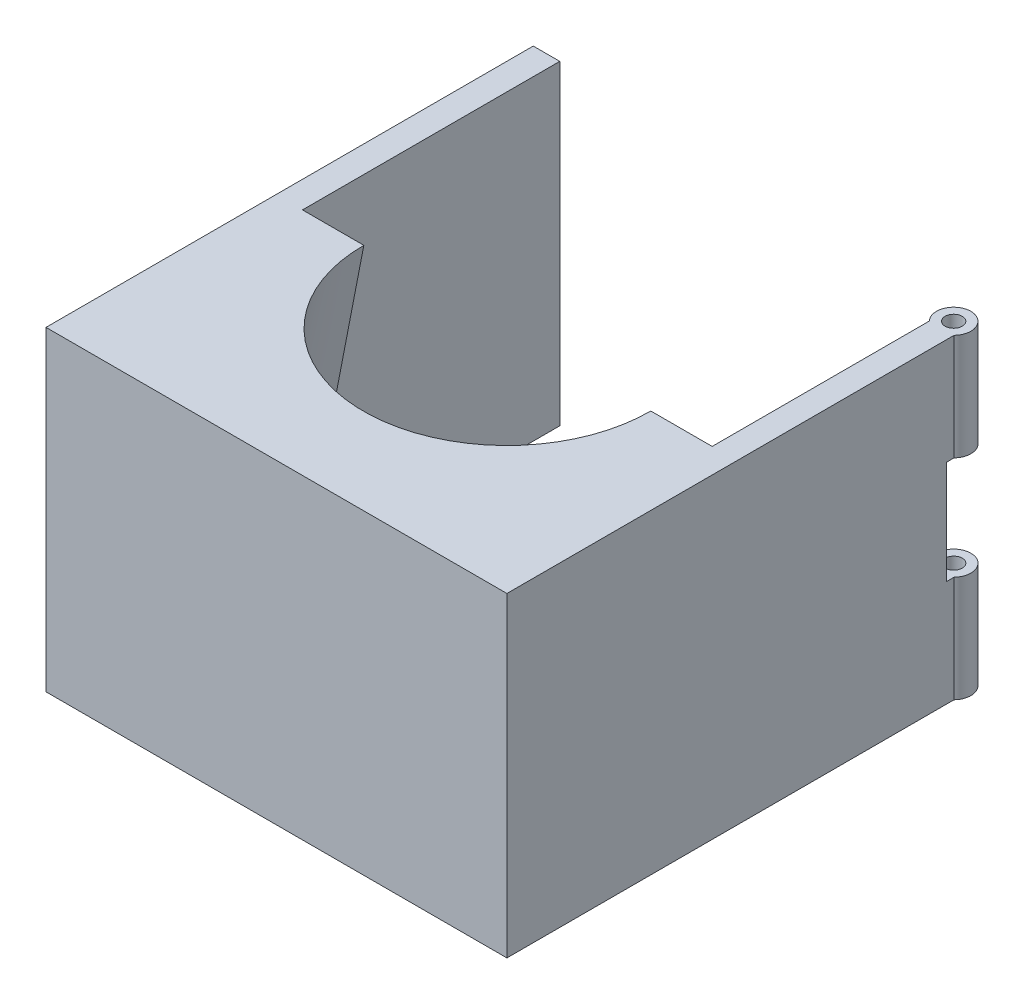
ISO-10303-21;
HEADER;
FILE_DESCRIPTION(('STEP AP214'),'2;1');
FILE_NAME('part.step','',(''),(''),'','','');
FILE_SCHEMA(('AUTOMOTIVE_DESIGN { 1 0 10303 214 1 1 1 1 }'));
ENDSEC;
DATA;
#1=APPLICATION_CONTEXT('core data for automotive mechanical design processes');
#2=APPLICATION_PROTOCOL_DEFINITION('international standard','automotive_design',2000,#1);
#3=PRODUCT_CONTEXT('',#1,'mechanical');
#4=PRODUCT('Part','Part','',(#3));
#5=PRODUCT_RELATED_PRODUCT_CATEGORY('part','',(#4));
#6=PRODUCT_DEFINITION_FORMATION('','',#4);
#7=PRODUCT_DEFINITION_CONTEXT('part definition',#1,'design');
#8=PRODUCT_DEFINITION('design','',#6,#7);
#9=PRODUCT_DEFINITION_SHAPE('','',#8);
#10=(LENGTH_UNIT() NAMED_UNIT(*) SI_UNIT(.MILLI.,.METRE.));
#11=(NAMED_UNIT(*) PLANE_ANGLE_UNIT() SI_UNIT($,.RADIAN.));
#12=(NAMED_UNIT(*) SI_UNIT($,.STERADIAN.) SOLID_ANGLE_UNIT());
#13=UNCERTAINTY_MEASURE_WITH_UNIT(LENGTH_MEASURE(1.E-05),#10,'distance_accuracy_value','');
#14=(GEOMETRIC_REPRESENTATION_CONTEXT(3) GLOBAL_UNCERTAINTY_ASSIGNED_CONTEXT((#13)) GLOBAL_UNIT_ASSIGNED_CONTEXT((#10,
#11,#12)) REPRESENTATION_CONTEXT('',''));
#15=CARTESIAN_POINT('',(0.,0.,0.));
#16=DIRECTION('',(0.,0.,1.));
#17=DIRECTION('',(1.,0.,0.));
#18=AXIS2_PLACEMENT_3D('',#15,#16,#17);
#19=CARTESIAN_POINT('',(39.0237365821785,13.5,-41.946027636255));
#20=DIRECTION('',(0.,-1.,0.));
#21=DIRECTION('',(0.,0.,-1.));
#22=AXIS2_PLACEMENT_3D('',#19,#20,#21);
#23=PLANE('',#22);
#24=CARTESIAN_POINT('',(36.3454585012873,13.5,-40.));
#25=CARTESIAN_POINT('',(36.3454568788567,13.5,-40.0237657226155));
#26=CARTESIAN_POINT('',(36.346002396856,13.5,-40.0475325313932));
#27=CARTESIAN_POINT('',(36.3481981892833,13.5,-40.0948507821752));
#28=CARTESIAN_POINT('',(36.3498408268793,13.5,-40.1184025798805));
#29=CARTESIAN_POINT('',(36.3542304662307,13.5,-40.1652910816181));
#30=CARTESIAN_POINT('',(36.3569722091633,13.5,-40.1886282761321));
#31=CARTESIAN_POINT('',(36.3635571110725,13.5,-40.2350873038941));
#32=CARTESIAN_POINT('',(36.3673974989006,13.5,-40.2582095297296));
#33=CARTESIAN_POINT('',(36.3761772529912,13.5,-40.3042388287939));
#34=CARTESIAN_POINT('',(36.3811163625007,13.5,-40.3271459509876));
#35=CARTESIAN_POINT('',(36.3920911679585,13.5,-40.3727453242988));
#36=CARTESIAN_POINT('',(36.3981290824127,13.5,-40.3954370411692));
#37=CARTESIAN_POINT('',(36.4112983801858,13.5,-40.440606591354));
#38=CARTESIAN_POINT('',(36.4184343481913,13.5,-40.4630830875934));
#39=CARTESIAN_POINT('',(36.4337998876046,13.5,-40.5078216953395));
#40=CARTESIAN_POINT('',(36.4420362608253,13.5,-40.5300814663016));
#41=CARTESIAN_POINT('',(36.4602803910467,13.5,-40.5761325127845));
#42=CARTESIAN_POINT('',(36.4703800776316,13.5,-40.5998874170008));
#43=CARTESIAN_POINT('',(36.4916799942313,13.5,-40.6466632766636));
#44=CARTESIAN_POINT('',(36.502870488224,13.5,-40.669688662022));
#45=CARTESIAN_POINT('',(36.5263518245011,13.5,-40.7150050622185));
#46=CARTESIAN_POINT('',(36.5386360149089,13.5,-40.7372995211376));
#47=CARTESIAN_POINT('',(36.5643008063033,13.5,-40.7811554344446));
#48=CARTESIAN_POINT('',(36.5776778835295,13.5,-40.8027189503635));
#49=CARTESIAN_POINT('',(36.6055254612237,13.5,-40.8451143965544));
#50=CARTESIAN_POINT('',(36.6199954755278,13.5,-40.8659466461404));
#51=CARTESIAN_POINT('',(36.6500259329244,13.5,-40.9068812786071));
#52=CARTESIAN_POINT('',(36.6655887414284,13.5,-40.9269819257052));
#53=CARTESIAN_POINT('',(36.6978016062621,13.5,-40.966455906153));
#54=CARTESIAN_POINT('',(36.7144566022445,13.5,-40.9858252070809));
#55=CARTESIAN_POINT('',(36.7488527456968,13.5,-41.023837159011));
#56=CARTESIAN_POINT('',(36.7666010724673,13.5,-41.0424733070428));
#57=CARTESIAN_POINT('',(36.8030502148476,13.5,-41.0789016336191));
#58=CARTESIAN_POINT('',(36.8217537298872,13.5,-41.0966911106111));
#59=CARTESIAN_POINT('',(36.8598798328977,13.5,-41.1311591292189));
#60=CARTESIAN_POINT('',(36.8792952416948,13.5,-41.1478456044062));
#61=CARTESIAN_POINT('',(36.9188440007557,13.5,-41.1801077282819));
#62=CARTESIAN_POINT('',(36.9389726161939,13.5,-41.1956891780513));
#63=CARTESIAN_POINT('',(36.9799449243065,13.5,-41.2257439637217));
#64=CARTESIAN_POINT('',(37.00078620224,13.5,-41.2402205905353));
#65=CARTESIAN_POINT('',(37.0431816073137,13.5,-41.2680682232696));
#66=CARTESIAN_POINT('',(37.064735415133,13.5,-41.2814397153003));
#67=CARTESIAN_POINT('',(37.1085538126163,13.5,-41.3070799287084));
#68=CARTESIAN_POINT('',(37.1308198833176,13.5,-41.319346118399));
#69=CARTESIAN_POINT('',(37.1760609617006,13.5,-41.3427789909119));
#70=CARTESIAN_POINT('',(37.1990389007221,13.5,-41.3539400111163));
#71=CARTESIAN_POINT('',(37.2457027338861,13.5,-41.3751648812597));
#72=CARTESIAN_POINT('',(37.2693926317146,13.5,-41.3852199213725));
#73=CARTESIAN_POINT('',(37.3154345539801,13.5,-41.4034307819229));
#74=CARTESIAN_POINT('',(37.3377526018376,13.5,-41.4116726682961));
#75=CARTESIAN_POINT('',(37.3825904888905,13.5,-41.4270492259553));
#76=CARTESIAN_POINT('',(37.405107769627,13.5,-41.4341913443074));
#77=CARTESIAN_POINT('',(37.4503429335672,13.5,-41.4473694387375));
#78=CARTESIAN_POINT('',(37.4730592708782,13.5,-41.4534107181065));
#79=CARTESIAN_POINT('',(37.5186915540834,13.5,-41.4643895933612));
#80=CARTESIAN_POINT('',(37.541606784426,13.5,-41.4693301616355));
#81=CARTESIAN_POINT('',(37.5876360467418,13.5,-41.478109971789));
#82=CARTESIAN_POINT('',(37.6107499794373,13.5,-41.4819497340768));
#83=CARTESIAN_POINT('',(37.6571760566733,13.5,-41.4885302931119));
#84=CARTESIAN_POINT('',(37.680488482941,13.5,-41.4912691008768));
#85=CARTESIAN_POINT('',(37.7273112402076,13.5,-41.4956508038443));
#86=CARTESIAN_POINT('',(37.7508219903513,13.5,-41.4972892140969));
#87=CARTESIAN_POINT('',(37.7980411862391,13.5,-41.4994705952911));
#88=CARTESIAN_POINT('',(37.8217499487095,13.5,-41.5000066501464));
#89=CARTESIAN_POINT('',(37.8692436687718,13.5,-41.4999933283635));
#90=CARTESIAN_POINT('',(37.893028625005,13.5,-41.4994404385226));
#91=CARTESIAN_POINT('',(37.9403784374448,13.5,-41.4972319134646));
#92=CARTESIAN_POINT('',(37.9639436572775,13.5,-41.4955841364078));
#93=CARTESIAN_POINT('',(38.0108535053374,13.5,-41.4911860699129));
#94=CARTESIAN_POINT('',(38.0341986480557,13.5,-41.4884412809599));
#95=CARTESIAN_POINT('',(38.0806682619751,13.5,-41.4818521558286));
#96=CARTESIAN_POINT('',(38.1037931619832,13.5,-41.4780108462127));
#97=CARTESIAN_POINT('',(38.1498224350339,13.5,-41.4692311022349));
#98=CARTESIAN_POINT('',(38.1727269073293,13.5,-41.4642931883225));
#99=CARTESIAN_POINT('',(38.2183155971145,13.5,-41.4533225997186));
#100=CARTESIAN_POINT('',(38.2409993444561,13.5,-41.4472879723106));
#101=CARTESIAN_POINT('',(38.2861475894746,13.5,-41.4341271654182));
#102=CARTESIAN_POINT('',(38.308610826757,13.5,-41.4269966631913));
#103=CARTESIAN_POINT('',(38.3533174079702,13.5,-41.4116436357779));
#104=CARTESIAN_POINT('',(38.3755584979528,13.5,-41.4034145596887));
#105=CARTESIAN_POINT('',(38.4215911411714,13.5,-41.3851784294685));
#106=CARTESIAN_POINT('',(38.4453459522067,13.5,-41.3750785088477));
#107=CARTESIAN_POINT('',(38.4921217443103,13.5,-41.353778422565));
#108=CARTESIAN_POINT('',(38.5151471543196,13.5,-41.3425879904867));
#109=CARTESIAN_POINT('',(38.5604635724423,13.5,-41.3191066992342));
#110=CARTESIAN_POINT('',(38.5827580248151,13.5,-41.3068224923848));
#111=CARTESIAN_POINT('',(38.6266139333468,13.5,-41.2811576889968));
#112=CARTESIAN_POINT('',(38.6481774510108,13.5,-41.2677806161539));
#113=CARTESIAN_POINT('',(38.6905728984788,13.5,-41.2399330416673));
#114=CARTESIAN_POINT('',(38.7114051475978,13.5,-41.22546302619));
#115=CARTESIAN_POINT('',(38.7523397797216,13.5,-41.195432567932));
#116=CARTESIAN_POINT('',(38.7724404269454,13.5,-41.1798697597434));
#117=CARTESIAN_POINT('',(38.8119144074858,13.5,-41.1476568951418));
#118=CARTESIAN_POINT('',(38.8312837083799,13.5,-41.1310018990743));
#119=CARTESIAN_POINT('',(38.8692956602853,13.5,-41.0966057555591));
#120=CARTESIAN_POINT('',(38.8879318083265,13.5,-41.0788574288116));
#121=CARTESIAN_POINT('',(38.9243601349095,13.5,-41.0424082864485));
#122=CARTESIAN_POINT('',(38.9421496118988,13.5,-41.0237047714032));
#123=CARTESIAN_POINT('',(38.9766176305044,13.5,-40.9855786683889));
#124=CARTESIAN_POINT('',(38.9933041056921,13.5,-40.9661632595937));
#125=CARTESIAN_POINT('',(39.0255662295681,13.5,-40.9266145005344));
#126=CARTESIAN_POINT('',(39.0411476793372,13.5,-40.906485885096));
#127=CARTESIAN_POINT('',(39.0712024650073,13.5,-40.8655135769833));
#128=CARTESIAN_POINT('',(39.0856790918209,13.5,-40.8446722990499));
#129=CARTESIAN_POINT('',(39.1135267245552,13.5,-40.8022768939763));
#130=CARTESIAN_POINT('',(39.126898216586,13.5,-40.7807230861569));
#131=CARTESIAN_POINT('',(39.1525384299942,13.5,-40.7369046886734));
#132=CARTESIAN_POINT('',(39.1648046196849,13.5,-40.7146386179719));
#133=CARTESIAN_POINT('',(39.1882374921981,13.5,-40.6693975395884));
#134=CARTESIAN_POINT('',(39.1993985124026,13.5,-40.6464196005667));
#135=CARTESIAN_POINT('',(39.2206233825465,13.5,-40.599755767402));
#136=CARTESIAN_POINT('',(39.2306784226596,13.5,-40.5760658695731));
#137=CARTESIAN_POINT('',(39.2488892832103,13.5,-40.5300239473071));
#138=CARTESIAN_POINT('',(39.2571311695837,13.5,-40.5077058994494));
#139=CARTESIAN_POINT('',(39.2725077272431,13.5,-40.4628680123963));
#140=CARTESIAN_POINT('',(39.2796498455953,13.5,-40.4403507316597));
#141=CARTESIAN_POINT('',(39.2928279400256,13.5,-40.3951155677194));
#142=CARTESIAN_POINT('',(39.2988692193946,13.5,-40.3723992304083));
#143=CARTESIAN_POINT('',(39.3098480946494,13.5,-40.3267669472031));
#144=CARTESIAN_POINT('',(39.3147886629237,13.5,-40.3038517168605));
#145=CARTESIAN_POINT('',(39.3235684730772,13.5,-40.2578224545446));
#146=CARTESIAN_POINT('',(39.327408235365,13.5,-40.2347085218492));
#147=CARTESIAN_POINT('',(39.3339887944,13.5,-40.1882824446133));
#148=CARTESIAN_POINT('',(39.3367276021649,13.5,-40.1649700183456));
#149=CARTESIAN_POINT('',(39.3411093051322,13.5,-40.1181472610791));
#150=CARTESIAN_POINT('',(39.3427477153847,13.5,-40.0946365109355));
#151=CARTESIAN_POINT('',(39.3449290965787,13.5,-40.047417315048));
#152=CARTESIAN_POINT('',(39.3454651514338,13.5,-40.0237085525777));
#153=CARTESIAN_POINT('',(39.3454518296506,13.5,-39.9762148325158));
#154=CARTESIAN_POINT('',(39.3448989398096,13.5,-39.952429876283));
#155=CARTESIAN_POINT('',(39.3426904147514,13.5,-39.9050800638439));
#156=CARTESIAN_POINT('',(39.3410426376945,13.5,-39.8815148440114));
#157=CARTESIAN_POINT('',(39.3366445711994,13.5,-39.8346049959519));
#158=CARTESIAN_POINT('',(39.3338997822464,13.5,-39.8112598532338));
#159=CARTESIAN_POINT('',(39.327310657115,13.5,-39.7647902393146));
#160=CARTESIAN_POINT('',(39.323469347499,13.5,-39.7416653393066));
#161=CARTESIAN_POINT('',(39.3146896035212,13.5,-39.6956360662559));
#162=CARTESIAN_POINT('',(39.3097516896089,13.5,-39.6727315939603));
#163=CARTESIAN_POINT('',(39.2987811010051,13.5,-39.627142904175));
#164=CARTESIAN_POINT('',(39.2927464735971,13.5,-39.6044591568332));
#165=CARTESIAN_POINT('',(39.2795856667048,13.5,-39.5593109118143));
#166=CARTESIAN_POINT('',(39.272455164478,13.5,-39.5368476745316));
#167=CARTESIAN_POINT('',(39.2571021370649,13.5,-39.4921410933179));
#168=CARTESIAN_POINT('',(39.2488730609758,13.5,-39.4699000033349));
#169=CARTESIAN_POINT('',(39.2306369307564,13.5,-39.4238673601167));
#170=CARTESIAN_POINT('',(39.2205370101362,13.5,-39.4001125490821));
#171=CARTESIAN_POINT('',(39.1992369238546,13.5,-39.3533367569798));
#172=CARTESIAN_POINT('',(39.1880464917767,13.5,-39.330311346971));
#173=CARTESIAN_POINT('',(39.1645652005249,13.5,-39.2849949288492));
#174=CARTESIAN_POINT('',(39.1522809936757,13.5,-39.2627004764766));
#175=CARTESIAN_POINT('',(39.126616190288,13.5,-39.2188445679454));
#176=CARTESIAN_POINT('',(39.1132391174452,13.5,-39.1972810502815));
#177=CARTESIAN_POINT('',(39.0853915429587,13.5,-39.1548856028135));
#178=CARTESIAN_POINT('',(39.0709215274812,13.5,-39.1340533536944));
#179=CARTESIAN_POINT('',(39.0408910692229,13.5,-39.0931187215702));
#180=CARTESIAN_POINT('',(39.025328261034,13.5,-39.0730180743461));
#181=CARTESIAN_POINT('',(38.9931153964317,13.5,-39.0335440938048));
#182=CARTESIAN_POINT('',(38.9764604003638,13.5,-39.0141747929102));
#183=CARTESIAN_POINT('',(38.9420642568476,13.5,-38.9761628410035));
#184=CARTESIAN_POINT('',(38.9243159300995,13.5,-38.9575266929615));
#185=CARTESIAN_POINT('',(38.8878667877358,13.5,-38.9210983663776));
#186=CARTESIAN_POINT('',(38.8691632726905,13.5,-38.9033088893882));
#187=CARTESIAN_POINT('',(38.8310371696761,13.5,-38.8688408707823));
#188=CARTESIAN_POINT('',(38.811621760881,13.5,-38.8521543955945));
#189=CARTESIAN_POINT('',(38.7720730018217,13.5,-38.8198922717183));
#190=CARTESIAN_POINT('',(38.7519443863832,13.5,-38.8043108219492));
#191=CARTESIAN_POINT('',(38.7109720782705,13.5,-38.7742560362789));
#192=CARTESIAN_POINT('',(38.6901308003372,13.5,-38.7597794094654));
#193=CARTESIAN_POINT('',(38.6477353952636,13.5,-38.731931776731));
#194=CARTESIAN_POINT('',(38.6261815874442,13.5,-38.7185602847003));
#195=CARTESIAN_POINT('',(38.5823631899606,13.5,-38.6929200712921));
#196=CARTESIAN_POINT('',(38.5600971192591,13.5,-38.6806538816015));
#197=CARTESIAN_POINT('',(38.5148560408757,13.5,-38.6572210090885));
#198=CARTESIAN_POINT('',(38.491878101854,13.5,-38.6460599888841));
#199=CARTESIAN_POINT('',(38.4452142686893,13.5,-38.6248351187405));
#200=CARTESIAN_POINT('',(38.4215243708604,13.5,-38.6147800786275));
#201=CARTESIAN_POINT('',(38.3754824485947,13.5,-38.5965692180772));
#202=CARTESIAN_POINT('',(38.3531644007374,13.5,-38.5883273317041));
#203=CARTESIAN_POINT('',(38.3083265136848,13.5,-38.5729507740452));
#204=CARTESIAN_POINT('',(38.2858092329485,13.5,-38.5658086556932));
#205=CARTESIAN_POINT('',(38.2405740690086,13.5,-38.5526305612633));
#206=CARTESIAN_POINT('',(38.2178577316976,13.5,-38.5465892818944));
#207=CARTESIAN_POINT('',(38.1722254484926,13.5,-38.5356104066397));
#208=CARTESIAN_POINT('',(38.14931021815,13.5,-38.5306698383654));
#209=CARTESIAN_POINT('',(38.1032809558341,13.5,-38.5218900282119));
#210=CARTESIAN_POINT('',(38.0801670231387,13.5,-38.5180502659241));
#211=CARTESIAN_POINT('',(38.0337409459026,13.5,-38.511469706889));
#212=CARTESIAN_POINT('',(38.0104285196347,13.5,-38.508730899124));
#213=CARTESIAN_POINT('',(37.9636057623679,13.5,-38.5043491961563));
#214=CARTESIAN_POINT('',(37.9400950122241,13.5,-38.5027107859037));
#215=CARTESIAN_POINT('',(37.892875816336,13.5,-38.5005294047092));
#216=CARTESIAN_POINT('',(37.8691670538653,13.5,-38.4999933498538));
#217=CARTESIAN_POINT('',(37.8216733338027,13.5,-38.5000066716364));
#218=CARTESIAN_POINT('',(37.7978883775694,13.5,-38.5005595614771));
#219=CARTESIAN_POINT('',(37.7505385651295,13.5,-38.5027680865349));
#220=CARTESIAN_POINT('',(37.7269733452968,13.5,-38.5044158635915));
#221=CARTESIAN_POINT('',(37.6800634972368,13.5,-38.5088139300863));
#222=CARTESIAN_POINT('',(37.6567183545184,13.5,-38.5115587190392));
#223=CARTESIAN_POINT('',(37.610248740599,13.5,-38.5181478441705));
#224=CARTESIAN_POINT('',(37.5871238405909,13.5,-38.5219891537864));
#225=CARTESIAN_POINT('',(37.5410945675402,13.5,-38.5307688977642));
#226=CARTESIAN_POINT('',(37.5181900952447,13.5,-38.5357068116765));
#227=CARTESIAN_POINT('',(37.4726014054596,13.5,-38.5466774002805));
#228=CARTESIAN_POINT('',(37.4499176581181,13.5,-38.5527120276886));
#229=CARTESIAN_POINT('',(37.4047694130997,13.5,-38.5658728345812));
#230=CARTESIAN_POINT('',(37.3823061758173,13.5,-38.5730033368082));
#231=CARTESIAN_POINT('',(37.3375995946043,13.5,-38.5883563642218));
#232=CARTESIAN_POINT('',(37.3153585046217,13.5,-38.5965854403112));
#233=CARTESIAN_POINT('',(37.2693258614029,13.5,-38.6148215705317));
#234=CARTESIAN_POINT('',(37.2455710503673,13.5,-38.6249214911529));
#235=CARTESIAN_POINT('',(37.1987952582632,13.5,-38.6462215774361));
#236=CARTESIAN_POINT('',(37.1757698482537,13.5,-38.6574120095146));
#237=CARTESIAN_POINT('',(37.1304534301307,13.5,-38.6808933007675));
#238=CARTESIAN_POINT('',(37.1081589777577,13.5,-38.6931775076171));
#239=CARTESIAN_POINT('',(37.0643030692259,13.5,-38.7188423110052));
#240=CARTESIAN_POINT('',(37.0427395515617,13.5,-38.7322193838481));
#241=CARTESIAN_POINT('',(37.0003441040938,13.5,-38.7600669583347));
#242=CARTESIAN_POINT('',(36.9795118549751,13.5,-38.7745369738121));
#243=CARTESIAN_POINT('',(36.9385772228511,13.5,-38.8045674320697));
#244=CARTESIAN_POINT('',(36.918476575627,13.5,-38.8201302402581));
#245=CARTESIAN_POINT('',(36.8790025950881,13.5,-38.8523431048598));
#246=CARTESIAN_POINT('',(36.8596332941958,13.5,-38.8689981009277));
#247=CARTESIAN_POINT('',(36.8216213422865,13.5,-38.9033942444407));
#248=CARTESIAN_POINT('',(36.8029851942394,13.5,-38.9211425711854));
#249=CARTESIAN_POINT('',(36.7665568676732,13.5,-38.9575917135551));
#250=CARTESIAN_POINT('',(36.7487673907066,13.5,-38.9762952286099));
#251=CARTESIAN_POINT('',(36.7142993720379,13.5,-39.0144213315999));
#252=CARTESIAN_POINT('',(36.6976128967652,13.5,-39.0338367403616));
#253=CARTESIAN_POINT('',(36.66535077312,13.5,-39.073385499513));
#254=CARTESIAN_POINT('',(36.6497693236644,13.5,-39.0935141150762));
#255=CARTESIAN_POINT('',(36.6197145371378,13.5,-39.134486422849));
#256=CARTESIAN_POINT('',(36.6052379091589,13.5,-39.1553277003196));
#257=CARTESIAN_POINT('',(36.5773902796094,13.5,-39.1977231066579));
#258=CARTESIAN_POINT('',(36.5640187919265,13.5,-39.2192769162038));
#259=CARTESIAN_POINT('',(36.5383785666254,13.5,-39.2630953089644));
#260=CARTESIAN_POINT('',(36.5261123606478,13.5,-39.2853613731982));
#261=CARTESIAN_POINT('',(36.5026795327239,13.5,-39.3306024692876));
#262=CARTESIAN_POINT('',(36.4915185737727,13.5,-39.3535804326328));
#263=CARTESIAN_POINT('',(36.4702935358017,13.5,-39.4002441991525));
#264=CARTESIAN_POINT('',(36.4602382644379,13.5,-39.4239340051512));
#265=CARTESIAN_POINT('',(36.4420353737636,13.5,-39.4699575528375));
#266=CARTESIAN_POINT('',(36.433800756183,13.5,-39.4922569496979));
#267=CARTESIAN_POINT('',(36.4184366638791,13.5,-39.5370628631649));
#268=CARTESIAN_POINT('',(36.4112999900996,13.5,-39.559566906791));
#269=CARTESIAN_POINT('',(36.398130357828,13.5,-39.6047807996946));
#270=CARTESIAN_POINT('',(36.392092356698,13.5,-39.6274891794038));
#271=CARTESIAN_POINT('',(36.3811176740798,13.5,-39.6731108001234));
#272=CARTESIAN_POINT('',(36.3761782852105,13.5,-39.6960233894834));
#273=CARTESIAN_POINT('',(36.3673985180944,13.5,-39.7420526137461));
#274=CARTESIAN_POINT('',(36.3635578831559,13.5,-39.7651691996879));
#275=CARTESIAN_POINT('',(36.3569729930736,13.5,-39.8116058913696));
#276=CARTESIAN_POINT('',(36.3542309827744,13.5,-39.8349263153254));
#277=CARTESIAN_POINT('',(36.3498413450794,13.5,-39.8817702127238));
#278=CARTESIAN_POINT('',(36.3481984490621,13.5,-39.9052941280166));
#279=CARTESIAN_POINT('',(36.3460026465497,13.5,-39.9525454766206));
#280=CARTESIAN_POINT('',(36.3454568608917,13.5,-39.9762732419763));
#281=CARTESIAN_POINT('',(36.3454585012873,13.5,-40.));
#282=B_SPLINE_CURVE_WITH_KNOTS('',3,(#24,#25,#26,#27,#28,#29,#30,#31,#32,#33,#34,#35,#36,#37,
#38,#39,#40,#41,#42,#43,#44,#45,#46,#47,#48,#49,#50,#51,#52,#53,#54,#55,#56,#57,#58,#59,#60,#61,
#62,#63,#64,#65,#66,#67,#68,#69,#70,#71,#72,#73,#74,#75,#76,#77,#78,#79,#80,#81,#82,#83,#84,#85,
#86,#87,#88,#89,#90,#91,#92,#93,#94,#95,#96,#97,#98,#99,#100,#101,#102,#103,#104,#105,#106,#107,
#108,#109,#110,#111,#112,#113,#114,#115,#116,#117,#118,#119,#120,#121,#122,#123,#124,#125,#126,
#127,#128,#129,#130,#131,#132,#133,#134,#135,#136,#137,#138,#139,#140,#141,#142,#143,#144,#145,
#146,#147,#148,#149,#150,#151,#152,#153,#154,#155,#156,#157,#158,#159,#160,#161,#162,#163,#164,
#165,#166,#167,#168,#169,#170,#171,#172,#173,#174,#175,#176,#177,#178,#179,#180,#181,#182,#183,
#184,#185,#186,#187,#188,#189,#190,#191,#192,#193,#194,#195,#196,#197,#198,#199,#200,#201,#202,
#203,#204,#205,#206,#207,#208,#209,#210,#211,#212,#213,#214,#215,#216,#217,#218,#219,#220,#221,
#222,#223,#224,#225,#226,#227,#228,#229,#230,#231,#232,#233,#234,#235,#236,#237,#238,#239,#240,
#241,#242,#243,#244,#245,#246,#247,#248,#249,#250,#251,#252,#253,#254,#255,#256,#257,#258,#259,
#260,#261,#262,#263,#264,#265,#266,#267,#268,#269,#270,#271,#272,#273,#274,#275,#276,#277,#278,
#279,#280,#281),.UNSPECIFIED.,.F.,.F.,(4,2,2,2,2,2,2,2,2,2,2,2,2,2,2,2,2,2,2,2,2,2,2,2,2,2,2,2,
2,2,2,2,2,2,2,2,2,2,2,2,2,2,2,2,2,2,2,2,2,2,2,2,2,2,2,2,2,2,2,2,2,2,2,2,2,2,2,2,2,2,2,2,2,2,2,2,
2,2,2,2,2,2,2,2,2,2,2,2,2,2,2,2,2,2,2,2,2,2,2,2,2,2,2,2,2,2,2,2,2,2,2,2,2,2,2,2,2,2,2,2,2,2,2,2,
2,2,2,2,4),(0.,0.0712924296852344,0.14209370816459,0.212560195870675,0.282850487493233,
0.353124370654545,0.423541744676781,0.49426153557889,0.565440643733745,0.642846465693996,
0.719615575740318,0.795946082154777,0.872039518993263,0.948099304810193,1.02432912755277,
1.1009313187775,1.17810528131486,1.25551092065758,1.33227993672175,1.40861040907677,
1.48470384210154,1.56076362415571,1.63699341295139,1.71359551025045,1.79076928998473,
1.86211825290425,1.93296054361078,2.00345196748916,2.07375066287713,2.14401606938058,
2.21440785280687,2.28508482247712,2.35620387726978,2.42755275544509,2.49839500538335,
2.56888641685706,2.63918511216927,2.7094505146761,2.77984227393879,2.85051918325538,
2.92163812591345,2.99904394787313,3.07581305791906,3.15214356433328,3.22823700117169,
3.3042967869887,3.38052660973149,3.45712880095658,3.53430276349444,3.61170840283579,
3.68847741889896,3.76480789125339,3.84090132427796,3.91696110633233,3.99319089512861,
4.06979299242867,4.14696677216433,4.21831573508437,4.28915802579125,4.35964944966984,
4.42994814505788,4.50021355156126,4.57060533498736,4.64128230465732,4.71240135944957,
4.7837502376238,4.85459248756131,4.92508389903457,4.99538259434665,5.06564799685362,
5.13603975611671,5.20671666543396,5.2778356080929,5.35524143004982,5.43201054009374,
5.50834104650675,5.58443448334475,5.66049426916216,5.73672409190619,5.81332628313333,
5.89050024567405,5.96790588501575,6.04467490107917,6.12100537343373,6.19709880645834,
6.27315858851267,6.34938837730884,6.42599047460874,6.50316425434418,6.57451321726299,
6.64535550796901,6.71584693184709,6.78614562723496,6.8564110337385,6.92680281716508,
6.99747978683579,7.06859884162907,7.1399477198046,7.210789969743,7.28128138121679,
7.35158007652903,7.42184547903583,7.49223723829847,7.562914147615,7.634033090273,
7.71143891223385,7.78820802228062,7.86453852869537,7.94063196553395,8.01669175135078,
8.09292157409303,8.16952376531723,8.24669772785382,8.32410336719648,8.40087238326058,
8.47720285561555,8.55329628864031,8.62935607069449,8.70558585949024,8.78218795678943,
8.85936173652387,8.93065064902376,9.00145013918226,9.07191599572744,9.1422062257829,
9.21248002114441,9.28289668507016,9.35361455532239,9.42478995948877),.UNSPECIFIED.);
#283=CARTESIAN_POINT('',(36.3454585012873,13.5,-40.));
#284=VERTEX_POINT('',#283);
#285=EDGE_CURVE('E144',#284,#284,#282,.T.);
#286=ORIENTED_EDGE('',*,*,#285,.T.);
#287=EDGE_LOOP('',(#286));
#288=FACE_BOUND('',#287,.T.);
#289=DIRECTION('',(1.,0.,0.));
#290=VECTOR('',#289,1.);
#291=CARTESIAN_POINT('',(35.6909170025745,13.5,-36.553624062064));
#292=LINE('',#291,#290);
#293=CARTESIAN_POINT('',(35.6909170025745,13.5,-36.553624062064));
#294=VERTEX_POINT('',#293);
#295=CARTESIAN_POINT('',(40.,13.5,-36.553624062064));
#296=VERTEX_POINT('',#295);
#297=EDGE_CURVE('E133',#294,#296,#292,.T.);
#298=ORIENTED_EDGE('',*,*,#297,.T.);
#299=DIRECTION('',(0.,0.,-1.));
#300=VECTOR('',#299,1.);
#301=CARTESIAN_POINT('',(40.,13.5,-41.946027636255));
#302=LINE('',#301,#300);
#303=CARTESIAN_POINT('',(40.,13.5,-37.9124294190795));
#304=VERTEX_POINT('',#303);
#305=EDGE_CURVE('E125',#304,#296,#302,.F.);
#306=ORIENTED_EDGE('',*,*,#305,.F.);
#307=CARTESIAN_POINT('',(37.8454585012873,13.5,-40.));
#308=DIRECTION('',(0.,-1.,0.));
#309=DIRECTION('',(-0.718180499570918,0.,0.695856860306821));
#310=AXIS2_PLACEMENT_3D('',#307,#308,#309);
#311=CIRCLE('',#310,3.00000000000001);
#312=CARTESIAN_POINT('',(35.6909170025745,13.5,-37.9124294190795));
#313=VERTEX_POINT('',#312);
#314=EDGE_CURVE('E130',#313,#304,#311,.T.);
#315=ORIENTED_EDGE('',*,*,#314,.F.);
#316=DIRECTION('',(0.,0.,-1.));
#317=VECTOR('',#316,1.);
#318=CARTESIAN_POINT('',(35.6909170025745,13.5,-41.946027636255));
#319=LINE('',#318,#317);
#320=EDGE_CURVE('E135',#294,#313,#319,.T.);
#321=ORIENTED_EDGE('',*,*,#320,.F.);
#322=EDGE_LOOP('',(#298,#306,#315,#321));
#323=FACE_BOUND('',#322,.T.);
#324=ADVANCED_FACE('F17',(#288,#323),#23,.F.);
#325=CARTESIAN_POINT('',(35.6909170025745,31.5,-36.553624062064));
#326=DIRECTION('',(0.,0.,1.));
#327=DIRECTION('',(1.,0.,0.));
#328=AXIS2_PLACEMENT_3D('',#325,#326,#327);
#329=PLANE('',#328);
#330=ORIENTED_EDGE('',*,*,#297,.F.);
#331=DIRECTION('',(0.,1.,0.));
#332=VECTOR('',#331,1.);
#333=CARTESIAN_POINT('',(35.6909170025745,-5.,-36.553624062064));
#334=LINE('',#333,#332);
#335=CARTESIAN_POINT('',(35.6909170025745,31.5,-36.553624062064));
#336=VERTEX_POINT('',#335);
#337=EDGE_CURVE('E177',#294,#336,#334,.T.);
#338=ORIENTED_EDGE('',*,*,#337,.T.);
#339=DIRECTION('',(1.,0.,0.));
#340=VECTOR('',#339,1.);
#341=CARTESIAN_POINT('',(39.0237365821785,31.5,-36.553624062064));
#342=LINE('',#341,#340);
#343=CARTESIAN_POINT('',(40.,31.5,-36.553624062064));
#344=VERTEX_POINT('',#343);
#345=EDGE_CURVE('E145',#336,#344,#342,.T.);
#346=ORIENTED_EDGE('',*,*,#345,.T.);
#347=DIRECTION('',(0.,1.,0.));
#348=VECTOR('',#347,1.);
#349=CARTESIAN_POINT('',(40.,0.,-36.553624062064));
#350=LINE('',#349,#348);
#351=EDGE_CURVE('E151',#296,#344,#350,.T.);
#352=ORIENTED_EDGE('',*,*,#351,.F.);
#353=EDGE_LOOP('',(#330,#338,#346,#352));
#354=FACE_BOUND('',#353,.T.);
#355=ADVANCED_FACE('F209',(#354),#329,.F.);
#356=CARTESIAN_POINT('',(39.0237365821785,31.5,-41.946027636255));
#357=DIRECTION('',(0.,1.,0.));
#358=DIRECTION('',(0.,0.,1.));
#359=AXIS2_PLACEMENT_3D('',#356,#357,#358);
#360=PLANE('',#359);
#361=CARTESIAN_POINT('',(37.8454585012873,31.5,-40.));
#362=DIRECTION('',(0.,1.,0.));
#363=DIRECTION('',(0.,0.,1.));
#364=AXIS2_PLACEMENT_3D('',#361,#362,#363);
#365=CIRCLE('',#364,1.5);
#366=CARTESIAN_POINT('',(37.8454585012873,31.5,-38.5));
#367=VERTEX_POINT('',#366);
#368=EDGE_CURVE('E21',#367,#367,#365,.T.);
#369=ORIENTED_EDGE('',*,*,#368,.T.);
#370=EDGE_LOOP('',(#369));
#371=FACE_BOUND('',#370,.T.);
#372=ORIENTED_EDGE('',*,*,#345,.F.);
#373=DIRECTION('',(0.,0.,-1.));
#374=VECTOR('',#373,1.);
#375=CARTESIAN_POINT('',(35.6909170025745,31.5,0.));
#376=LINE('',#375,#374);
#377=CARTESIAN_POINT('',(35.6909170025745,31.5,-37.9124294190795));
#378=VERTEX_POINT('',#377);
#379=EDGE_CURVE('E198',#336,#378,#376,.T.);
#380=ORIENTED_EDGE('',*,*,#379,.T.);
#381=CARTESIAN_POINT('',(37.8454585012873,31.5,-40.));
#382=DIRECTION('',(0.,1.,0.));
#383=DIRECTION('',(0.718180499570902,0.,0.695856860306837));
#384=AXIS2_PLACEMENT_3D('',#381,#382,#383);
#385=CIRCLE('',#384,3.00000000000001);
#386=CARTESIAN_POINT('',(40.,31.5,-37.9124294190795));
#387=VERTEX_POINT('',#386);
#388=EDGE_CURVE('E154',#387,#378,#385,.T.);
#389=ORIENTED_EDGE('',*,*,#388,.F.);
#390=DIRECTION('',(0.,0.,-1.));
#391=VECTOR('',#390,1.);
#392=CARTESIAN_POINT('',(40.,31.5,40.));
#393=LINE('',#392,#391);
#394=EDGE_CURVE('E156',#344,#387,#393,.T.);
#395=ORIENTED_EDGE('',*,*,#394,.F.);
#396=EDGE_LOOP('',(#372,#380,#389,#395));
#397=FACE_BOUND('',#396,.T.);
#398=ADVANCED_FACE('F200',(#371,#397),#360,.F.);
#399=CARTESIAN_POINT('',(37.8454585012873,-5.,-40.));
#400=DIRECTION('',(0.,1.,0.));
#401=DIRECTION('',(0.,0.,1.));
#402=AXIS2_PLACEMENT_3D('',#399,#400,#401);
#403=CYLINDRICAL_SURFACE('',#402,3.00000000000001);
#404=CARTESIAN_POINT('',(37.8454585012873,-5.,-40.));
#405=DIRECTION('',(0.,1.,0.));
#406=DIRECTION('',(0.,0.,1.));
#407=AXIS2_PLACEMENT_3D('',#404,#405,#406);
#408=CIRCLE('',#407,3.00000000000001);
#409=CARTESIAN_POINT('',(35.6909170025745,-5.,-37.9124294190795));
#410=VERTEX_POINT('',#409);
#411=CARTESIAN_POINT('',(40.,-5.,-37.9124294190795));
#412=VERTEX_POINT('',#411);
#413=EDGE_CURVE('E272',#410,#412,#408,.F.);
#414=ORIENTED_EDGE('',*,*,#413,.F.);
#415=DIRECTION('',(0.,1.,0.));
#416=VECTOR('',#415,1.);
#417=CARTESIAN_POINT('',(35.6909170025745,-5.,-37.9124294190795));
#418=LINE('',#417,#416);
#419=EDGE_CURVE('E67',#410,#313,#418,.T.);
#420=ORIENTED_EDGE('',*,*,#419,.T.);
#421=ORIENTED_EDGE('',*,*,#314,.T.);
#422=DIRECTION('',(0.,1.,0.));
#423=VECTOR('',#422,1.);
#424=CARTESIAN_POINT('',(40.,0.,-37.9124294190795));
#425=LINE('',#424,#423);
#426=EDGE_CURVE('E142',#412,#304,#425,.T.);
#427=ORIENTED_EDGE('',*,*,#426,.F.);
#428=EDGE_LOOP('',(#414,#420,#421,#427));
#429=FACE_BOUND('',#428,.T.);
#430=ADVANCED_FACE('F141',(#429),#403,.T.);
#431=CARTESIAN_POINT('',(37.8454585012873,-5.,-40.));
#432=DIRECTION('',(0.,1.,0.));
#433=DIRECTION('',(0.,0.,1.));
#434=AXIS2_PLACEMENT_3D('',#431,#432,#433);
#435=CYLINDRICAL_SURFACE('',#434,1.5);
#436=ORIENTED_EDGE('',*,*,#285,.F.);
#437=EDGE_LOOP('',(#436));
#438=FACE_BOUND('',#437,.T.);
#439=CARTESIAN_POINT('',(37.8454585012873,-5.,-40.));
#440=DIRECTION('',(0.,1.,0.));
#441=DIRECTION('',(0.,0.,1.));
#442=AXIS2_PLACEMENT_3D('',#439,#440,#441);
#443=CIRCLE('',#442,1.5);
#444=CARTESIAN_POINT('',(37.8454585012873,-5.,-38.5));
#445=VERTEX_POINT('',#444);
#446=EDGE_CURVE('E167',#445,#445,#443,.T.);
#447=ORIENTED_EDGE('',*,*,#446,.F.);
#448=EDGE_LOOP('',(#447));
#449=FACE_BOUND('',#448,.T.);
#450=ADVANCED_FACE('F406',(#438,#449),#435,.F.);
#451=CARTESIAN_POINT('',(0.,-5.,0.));
#452=DIRECTION('',(0.,1.,0.));
#453=DIRECTION('',(0.,0.,1.));
#454=AXIS2_PLACEMENT_3D('',#451,#452,#453);
#455=CYLINDRICAL_SURFACE('',#454,35.6909170025745);
#456=DIRECTION('',(0.,1.,0.));
#457=VECTOR('',#456,1.);
#458=CARTESIAN_POINT('',(35.6909170025745,-5.,0.));
#459=LINE('',#458,#457);
#460=CARTESIAN_POINT('',(35.6909170025745,50.,0.));
#461=VERTEX_POINT('',#460);
#462=CARTESIAN_POINT('',(35.6909170025745,-4.99999999999999,0.));
#463=VERTEX_POINT('',#462);
#464=EDGE_CURVE('E170',#461,#463,#459,.F.);
#465=ORIENTED_EDGE('',*,*,#464,.T.);
#466=CARTESIAN_POINT('',(0.,-5.,0.));
#467=DIRECTION('',(0.,1.,0.));
#468=DIRECTION('',(0.,0.,1.));
#469=AXIS2_PLACEMENT_3D('',#466,#467,#468);
#470=CIRCLE('',#469,35.6909170025745);
#471=CARTESIAN_POINT('',(35.6908477343095,-4.99999999999995,-0.0703170747028148));
#472=VERTEX_POINT('',#471);
#473=EDGE_CURVE('E160',#463,#472,#470,.T.);
#474=ORIENTED_EDGE('',*,*,#473,.T.);
#475=DIRECTION('',(0.,1.,0.));
#476=VECTOR('',#475,1.);
#477=CARTESIAN_POINT('',(35.6908477343095,-5.,-0.0703170747028148));
#478=LINE('',#477,#476);
#479=CARTESIAN_POINT('',(35.690882368442,50.,-0.070317074702814));
#480=VERTEX_POINT('',#479);
#481=EDGE_CURVE('E271',#472,#480,#478,.T.);
#482=ORIENTED_EDGE('',*,*,#481,.T.);
#483=CARTESIAN_POINT('',(0.,50.,0.));
#484=DIRECTION('',(0.,-1.,0.));
#485=DIRECTION('',(0.999998059218681,0.,-0.00197016721923221));
#486=AXIS2_PLACEMENT_3D('',#483,#484,#485);
#487=CIRCLE('',#486,35.6909170025745);
#488=EDGE_CURVE('E173',#480,#461,#487,.T.);
#489=ORIENTED_EDGE('',*,*,#488,.T.);
#490=EDGE_LOOP('',(#465,#474,#482,#489));
#491=FACE_BOUND('',#490,.T.);
#492=ADVANCED_FACE('F415',(#491),#455,.T.);
#493=CARTESIAN_POINT('',(-40.31,0.,-40.));
#494=DIRECTION('',(1.,0.,0.));
#495=DIRECTION('',(0.,0.,-1.));
#496=AXIS2_PLACEMENT_3D('',#493,#494,#495);
#497=PLANE('',#496);
#498=DIRECTION('',(0.,0.,-1.));
#499=VECTOR('',#498,1.);
#500=CARTESIAN_POINT('',(-40.31,-5.,0.));
#501=LINE('',#500,#499);
#502=CARTESIAN_POINT('',(-40.31,-5.,40.));
#503=VERTEX_POINT('',#502);
#504=CARTESIAN_POINT('',(-40.31,-5.,-44.9));
#505=VERTEX_POINT('',#504);
#506=EDGE_CURVE('E182',#503,#505,#501,.T.);
#507=ORIENTED_EDGE('',*,*,#506,.F.);
#508=DIRECTION('',(0.,1.,0.));
#509=VECTOR('',#508,1.);
#510=CARTESIAN_POINT('',(-40.31,0.,40.));
#511=LINE('',#510,#509);
#512=CARTESIAN_POINT('',(-40.31,50.,40.));
#513=VERTEX_POINT('',#512);
#514=EDGE_CURVE('E312',#513,#503,#511,.F.);
#515=ORIENTED_EDGE('',*,*,#514,.F.);
#516=DIRECTION('',(0.,0.,1.));
#517=VECTOR('',#516,1.);
#518=CARTESIAN_POINT('',(-40.31,50.,0.));
#519=LINE('',#518,#517);
#520=CARTESIAN_POINT('',(-40.31,50.,-44.9));
#521=VERTEX_POINT('',#520);
#522=EDGE_CURVE('E309',#521,#513,#519,.T.);
#523=ORIENTED_EDGE('',*,*,#522,.F.);
#524=DIRECTION('',(0.,1.,0.));
#525=VECTOR('',#524,1.);
#526=CARTESIAN_POINT('',(-40.31,0.,-44.9));
#527=LINE('',#526,#525);
#528=EDGE_CURVE('E319',#521,#505,#527,.F.);
#529=ORIENTED_EDGE('',*,*,#528,.T.);
#530=EDGE_LOOP('',(#507,#515,#523,#529));
#531=FACE_BOUND('',#530,.T.);
#532=ADVANCED_FACE('F419',(#531),#497,.F.);
#533=CARTESIAN_POINT('',(-40.,0.,40.));
#534=DIRECTION('',(0.,0.,1.));
#535=DIRECTION('',(1.,0.,0.));
#536=AXIS2_PLACEMENT_3D('',#533,#534,#535);
#537=PLANE('',#536);
#538=DIRECTION('',(0.,1.,0.));
#539=VECTOR('',#538,1.);
#540=CARTESIAN_POINT('',(40.,0.,40.));
#541=LINE('',#540,#539);
#542=CARTESIAN_POINT('',(40.,50.,40.));
#543=VERTEX_POINT('',#542);
#544=CARTESIAN_POINT('',(40.,-5.,40.));
#545=VERTEX_POINT('',#544);
#546=EDGE_CURVE('E152',#543,#545,#541,.F.);
#547=ORIENTED_EDGE('',*,*,#546,.F.);
#548=DIRECTION('',(1.,0.,0.));
#549=VECTOR('',#548,1.);
#550=CARTESIAN_POINT('',(0.,50.,40.));
#551=LINE('',#550,#549);
#552=EDGE_CURVE('E307',#513,#543,#551,.T.);
#553=ORIENTED_EDGE('',*,*,#552,.F.);
#554=ORIENTED_EDGE('',*,*,#514,.T.);
#555=DIRECTION('',(1.,0.,0.));
#556=VECTOR('',#555,1.);
#557=CARTESIAN_POINT('',(0.,-5.,40.));
#558=LINE('',#557,#556);
#559=EDGE_CURVE('E164',#545,#503,#558,.F.);
#560=ORIENTED_EDGE('',*,*,#559,.F.);
#561=EDGE_LOOP('',(#547,#553,#554,#560));
#562=FACE_BOUND('',#561,.T.);
#563=ADVANCED_FACE('F547',(#562),#537,.T.);
#564=CARTESIAN_POINT('',(40.,0.,40.));
#565=DIRECTION('',(1.,0.,0.));
#566=DIRECTION('',(0.,0.,-1.));
#567=AXIS2_PLACEMENT_3D('',#564,#565,#566);
#568=PLANE('',#567);
#569=ORIENTED_EDGE('',*,*,#305,.T.);
#570=ORIENTED_EDGE('',*,*,#351,.T.);
#571=ORIENTED_EDGE('',*,*,#394,.T.);
#572=DIRECTION('',(0.,1.,0.));
#573=VECTOR('',#572,1.);
#574=CARTESIAN_POINT('',(40.,-5.,-37.9124294190795));
#575=LINE('',#574,#573);
#576=CARTESIAN_POINT('',(40.,50.,-37.9124294190795));
#577=VERTEX_POINT('',#576);
#578=EDGE_CURVE('E298',#577,#387,#575,.F.);
#579=ORIENTED_EDGE('',*,*,#578,.F.);
#580=DIRECTION('',(0.,0.,1.));
#581=VECTOR('',#580,1.);
#582=CARTESIAN_POINT('',(40.,50.,0.));
#583=LINE('',#582,#581);
#584=EDGE_CURVE('E269',#543,#577,#583,.F.);
#585=ORIENTED_EDGE('',*,*,#584,.F.);
#586=ORIENTED_EDGE('',*,*,#546,.T.);
#587=DIRECTION('',(0.,0.,-1.));
#588=VECTOR('',#587,1.);
#589=CARTESIAN_POINT('',(40.,-5.,0.));
#590=LINE('',#589,#588);
#591=EDGE_CURVE('E150',#412,#545,#590,.F.);
#592=ORIENTED_EDGE('',*,*,#591,.F.);
#593=ORIENTED_EDGE('',*,*,#426,.T.);
#594=EDGE_LOOP('',(#569,#570,#571,#579,#585,#586,#592,#593));
#595=FACE_BOUND('',#594,.T.);
#596=ADVANCED_FACE('F148',(#595),#568,.T.);
#597=CARTESIAN_POINT('',(37.8454585012873,-5.,-40.));
#598=DIRECTION('',(0.,1.,0.));
#599=DIRECTION('',(0.,0.,1.));
#600=AXIS2_PLACEMENT_3D('',#597,#598,#599);
#601=CYLINDRICAL_SURFACE('',#600,3.00000000000001);
#602=CARTESIAN_POINT('',(37.8454585012873,50.,-40.));
#603=DIRECTION('',(0.,1.,0.));
#604=DIRECTION('',(0.,0.,1.));
#605=AXIS2_PLACEMENT_3D('',#602,#603,#604);
#606=CIRCLE('',#605,3.00000000000001);
#607=CARTESIAN_POINT('',(35.6909170025745,50.,-37.9124294190795));
#608=VERTEX_POINT('',#607);
#609=EDGE_CURVE('E266',#577,#608,#606,.T.);
#610=ORIENTED_EDGE('',*,*,#609,.F.);
#611=ORIENTED_EDGE('',*,*,#578,.T.);
#612=ORIENTED_EDGE('',*,*,#388,.T.);
#613=DIRECTION('',(0.,1.,0.));
#614=VECTOR('',#613,1.);
#615=CARTESIAN_POINT('',(35.6909170025745,-5.,-37.9124294190795));
#616=LINE('',#615,#614);
#617=EDGE_CURVE('E295',#378,#608,#616,.T.);
#618=ORIENTED_EDGE('',*,*,#617,.T.);
#619=EDGE_LOOP('',(#610,#611,#612,#618));
#620=FACE_BOUND('',#619,.T.);
#621=ADVANCED_FACE('F359',(#620),#601,.T.);
#622=CARTESIAN_POINT('',(35.6909170025745,-5.,0.));
#623=DIRECTION('',(1.,0.,0.));
#624=DIRECTION('',(0.,0.,-1.));
#625=AXIS2_PLACEMENT_3D('',#622,#623,#624);
#626=PLANE('',#625);
#627=ORIENTED_EDGE('',*,*,#337,.F.);
#628=ORIENTED_EDGE('',*,*,#320,.T.);
#629=ORIENTED_EDGE('',*,*,#419,.F.);
#630=DIRECTION('',(0.,0.,-1.));
#631=VECTOR('',#630,1.);
#632=CARTESIAN_POINT('',(35.6909170025745,-5.,0.));
#633=LINE('',#632,#631);
#634=EDGE_CURVE('E273',#463,#410,#633,.T.);
#635=ORIENTED_EDGE('',*,*,#634,.F.);
#636=ORIENTED_EDGE('',*,*,#464,.F.);
#637=ORIENTED_EDGE('',*,*,#488,.F.);
#638=DIRECTION('',(0.,0.,1.));
#639=VECTOR('',#638,1.);
#640=CARTESIAN_POINT('',(35.6909170025745,50.,0.));
#641=LINE('',#640,#639);
#642=EDGE_CURVE('E268',#608,#480,#641,.T.);
#643=ORIENTED_EDGE('',*,*,#642,.F.);
#644=ORIENTED_EDGE('',*,*,#617,.F.);
#645=ORIENTED_EDGE('',*,*,#379,.F.);
#646=EDGE_LOOP('',(#627,#628,#629,#635,#636,#637,#643,#644,#645));
#647=FACE_BOUND('',#646,.T.);
#648=ADVANCED_FACE('F348',(#647),#626,.F.);
#649=CARTESIAN_POINT('',(40.,0.,-44.9));
#650=DIRECTION('',(0.,0.,1.));
#651=DIRECTION('',(1.,0.,0.));
#652=AXIS2_PLACEMENT_3D('',#649,#650,#651);
#653=PLANE('',#652);
#654=DIRECTION('',(1.,0.,0.));
#655=VECTOR('',#654,1.);
#656=CARTESIAN_POINT('',(0.,50.,-44.9));
#657=LINE('',#656,#655);
#658=CARTESIAN_POINT('',(-35.6908477343095,50.,-44.9));
#659=VERTEX_POINT('',#658);
#660=EDGE_CURVE('E265',#659,#521,#657,.F.);
#661=ORIENTED_EDGE('',*,*,#660,.F.);
#662=DIRECTION('',(0.,1.,0.));
#663=VECTOR('',#662,1.);
#664=CARTESIAN_POINT('',(-35.6908477343095,-5.,-44.9));
#665=LINE('',#664,#663);
#666=CARTESIAN_POINT('',(-35.6908477343095,-5.,-44.9));
#667=VERTEX_POINT('',#666);
#668=EDGE_CURVE('E186',#659,#667,#665,.F.);
#669=ORIENTED_EDGE('',*,*,#668,.T.);
#670=DIRECTION('',(1.,0.,0.));
#671=VECTOR('',#670,1.);
#672=CARTESIAN_POINT('',(0.,-5.,-44.9));
#673=LINE('',#672,#671);
#674=EDGE_CURVE('E77',#505,#667,#673,.T.);
#675=ORIENTED_EDGE('',*,*,#674,.F.);
#676=ORIENTED_EDGE('',*,*,#528,.F.);
#677=EDGE_LOOP('',(#661,#669,#675,#676));
#678=FACE_BOUND('',#677,.T.);
#679=ADVANCED_FACE('F358',(#678),#653,.F.);
#680=CARTESIAN_POINT('',(37.8454585012873,-5.,-40.));
#681=DIRECTION('',(0.,1.,0.));
#682=DIRECTION('',(0.,0.,1.));
#683=AXIS2_PLACEMENT_3D('',#680,#681,#682);
#684=CYLINDRICAL_SURFACE('',#683,1.5);
#685=CARTESIAN_POINT('',(37.8454585012873,50.,-40.));
#686=DIRECTION('',(0.,1.,0.));
#687=DIRECTION('',(0.,0.,1.));
#688=AXIS2_PLACEMENT_3D('',#685,#686,#687);
#689=CIRCLE('',#688,1.5);
#690=CARTESIAN_POINT('',(37.8454585012873,50.,-38.5));
#691=VERTEX_POINT('',#690);
#692=EDGE_CURVE('E262',#691,#691,#689,.F.);
#693=ORIENTED_EDGE('',*,*,#692,.F.);
#694=EDGE_LOOP('',(#693));
#695=FACE_BOUND('',#694,.T.);
#696=ORIENTED_EDGE('',*,*,#368,.F.);
#697=EDGE_LOOP('',(#696));
#698=FACE_BOUND('',#697,.T.);
#699=ADVANCED_FACE('F470',(#695,#698),#684,.F.);
#700=CARTESIAN_POINT('',(-35.6908477343095,-5.,-40.));
#701=DIRECTION('',(-1.,0.,0.));
#702=DIRECTION('',(0.,0.,1.));
#703=AXIS2_PLACEMENT_3D('',#700,#701,#702);
#704=PLANE('',#703);
#705=DIRECTION('',(0.,0.,1.));
#706=VECTOR('',#705,1.);
#707=CARTESIAN_POINT('',(-35.6908477343095,50.,0.));
#708=LINE('',#707,#706);
#709=CARTESIAN_POINT('',(-35.6908477343095,50.,-0.0703170747028148));
#710=VERTEX_POINT('',#709);
#711=EDGE_CURVE('E282',#710,#659,#708,.F.);
#712=ORIENTED_EDGE('',*,*,#711,.F.);
#713=DIRECTION('',(0.,1.,0.));
#714=VECTOR('',#713,1.);
#715=CARTESIAN_POINT('',(-35.6908477343095,-5.,-0.0703170747028148));
#716=LINE('',#715,#714);
#717=CARTESIAN_POINT('',(-35.6908477343095,-4.99999999999994,-0.0703170747068387));
#718=VERTEX_POINT('',#717);
#719=EDGE_CURVE('E257',#710,#718,#716,.F.);
#720=ORIENTED_EDGE('',*,*,#719,.T.);
#721=DIRECTION('',(0.,0.,-1.));
#722=VECTOR('',#721,1.);
#723=CARTESIAN_POINT('',(-35.6908477343095,-5.,0.));
#724=LINE('',#723,#722);
#725=EDGE_CURVE('E181',#667,#718,#724,.F.);
#726=ORIENTED_EDGE('',*,*,#725,.F.);
#727=ORIENTED_EDGE('',*,*,#668,.F.);
#728=EDGE_LOOP('',(#712,#720,#726,#727));
#729=FACE_BOUND('',#728,.T.);
#730=ADVANCED_FACE('F460',(#729),#704,.F.);
#731=CARTESIAN_POINT('',(0.,-5.,0.));
#732=DIRECTION('',(0.,-1.,0.));
#733=DIRECTION('',(0.,0.,-1.));
#734=AXIS2_PLACEMENT_3D('',#731,#732,#733);
#735=PLANE('',#734);
#736=ORIENTED_EDGE('',*,*,#446,.T.);
#737=EDGE_LOOP('',(#736));
#738=FACE_BOUND('',#737,.T.);
#739=ORIENTED_EDGE('',*,*,#591,.T.);
#740=ORIENTED_EDGE('',*,*,#559,.T.);
#741=ORIENTED_EDGE('',*,*,#506,.T.);
#742=ORIENTED_EDGE('',*,*,#674,.T.);
#743=ORIENTED_EDGE('',*,*,#725,.T.);
#744=CARTESIAN_POINT('',(0.,-4.99999999999998,0.));
#745=DIRECTION('',(0.,-1.,0.));
#746=DIRECTION('',(0.,0.,-1.));
#747=AXIS2_PLACEMENT_3D('',#744,#745,#746);
#748=CIRCLE('',#747,35.6909170025745);
#749=EDGE_CURVE('E251',#718,#463,#748,.F.);
#750=ORIENTED_EDGE('',*,*,#749,.T.);
#751=ORIENTED_EDGE('',*,*,#634,.T.);
#752=ORIENTED_EDGE('',*,*,#413,.T.);
#753=EDGE_LOOP('',(#739,#740,#741,#742,#743,#750,#751,#752));
#754=FACE_BOUND('',#753,.T.);
#755=ADVANCED_FACE('F461',(#738,#754),#735,.T.);
#756=CARTESIAN_POINT('',(-35.6908477343095,-5.,-0.0703170747028148));
#757=DIRECTION('',(0.,0.,1.));
#758=DIRECTION('',(1.,0.,0.));
#759=AXIS2_PLACEMENT_3D('',#756,#757,#758);
#760=PLANE('',#759);
#761=ORIENTED_EDGE('',*,*,#481,.F.);
#762=CARTESIAN_POINT('',(35.6908477343095,-4.99999999999999,-0.0703170747028148));
#763=CARTESIAN_POINT('',(33.909024972928,4.16666699245014,-0.0703170747028148));
#764=CARTESIAN_POINT('',(32.1272013735436,13.3333338220085,-0.0703170747028148));
#765=CARTESIAN_POINT('',(28.5635524987686,31.6666671553419,-0.0703170747028148));
#766=CARTESIAN_POINT('',(26.7817272233781,40.8333336591168,-0.0703170747028148));
#767=CARTESIAN_POINT('',(24.9999011099845,50.,-0.0703170747028148));
#768=B_SPLINE_CURVE_WITH_KNOTS('',3,(#762,#763,#764,#765,#766,#767),.UNSPECIFIED.,.F.,.F.,(4,2,
4),(0.,28.0147119373205,56.029423874641),.UNSPECIFIED.);
#769=CARTESIAN_POINT('',(24.9999011099845,50.,-0.0703170747028148));
#770=VERTEX_POINT('',#769);
#771=EDGE_CURVE('E236',#472,#770,#768,.T.);
#772=ORIENTED_EDGE('',*,*,#771,.T.);
#773=DIRECTION('',(1.,0.,0.));
#774=VECTOR('',#773,1.);
#775=CARTESIAN_POINT('',(0.,50.,-0.0703170747028148));
#776=LINE('',#775,#774);
#777=EDGE_CURVE('E285',#480,#770,#776,.F.);
#778=ORIENTED_EDGE('',*,*,#777,.F.);
#779=EDGE_LOOP('',(#761,#772,#778));
#780=FACE_BOUND('',#779,.T.);
#781=ADVANCED_FACE('F446',(#780),#760,.F.);
#782=CARTESIAN_POINT('',(0.,50.,0.));
#783=DIRECTION('',(0.,1.,0.));
#784=DIRECTION('',(0.,0.,1.));
#785=AXIS2_PLACEMENT_3D('',#782,#783,#784);
#786=PLANE('',#785);
#787=ORIENTED_EDGE('',*,*,#692,.T.);
#788=EDGE_LOOP('',(#787));
#789=FACE_BOUND('',#788,.T.);
#790=ORIENTED_EDGE('',*,*,#711,.T.);
#791=ORIENTED_EDGE('',*,*,#660,.T.);
#792=ORIENTED_EDGE('',*,*,#522,.T.);
#793=ORIENTED_EDGE('',*,*,#552,.T.);
#794=ORIENTED_EDGE('',*,*,#584,.T.);
#795=ORIENTED_EDGE('',*,*,#609,.T.);
#796=ORIENTED_EDGE('',*,*,#642,.T.);
#797=ORIENTED_EDGE('',*,*,#777,.T.);
#798=CARTESIAN_POINT('',(0.,50.,0.));
#799=DIRECTION('',(0.,-1.,0.));
#800=DIRECTION('',(0.,0.,-1.));
#801=AXIS2_PLACEMENT_3D('',#798,#799,#800);
#802=CIRCLE('',#801,25.);
#803=CARTESIAN_POINT('',(-24.9999011099845,50.,-0.0703170747028148));
#804=VERTEX_POINT('',#803);
#805=EDGE_CURVE('E27',#770,#804,#802,.T.);
#806=ORIENTED_EDGE('',*,*,#805,.T.);
#807=DIRECTION('',(1.,0.,0.));
#808=VECTOR('',#807,1.);
#809=CARTESIAN_POINT('',(-35.6908477343095,50.,-0.0703170747028148));
#810=LINE('',#809,#808);
#811=EDGE_CURVE('E35',#804,#710,#810,.F.);
#812=ORIENTED_EDGE('',*,*,#811,.T.);
#813=EDGE_LOOP('',(#790,#791,#792,#793,#794,#795,#796,#797,#806,#812));
#814=FACE_BOUND('',#813,.T.);
#815=ADVANCED_FACE('F228',(#789,#814),#786,.T.);
#816=CARTESIAN_POINT('',(-35.6908477343095,-5.,-0.0703170747028148));
#817=DIRECTION('',(0.,0.,1.));
#818=DIRECTION('',(1.,0.,0.));
#819=AXIS2_PLACEMENT_3D('',#816,#817,#818);
#820=PLANE('',#819);
#821=ORIENTED_EDGE('',*,*,#719,.F.);
#822=ORIENTED_EDGE('',*,*,#811,.F.);
#823=CARTESIAN_POINT('',(-24.9999011099845,50.,-0.0703170747028148));
#824=CARTESIAN_POINT('',(-27.6704899076399,36.2610620711682,-0.0703170747028148));
#825=CARTESIAN_POINT('',(-30.3410769748646,22.5221238059738,-0.0703170747028148));
#826=CARTESIAN_POINT('',(-33.9047243127194,4.18879017389271,-0.0703170747028148));
#827=CARTESIAN_POINT('',(-34.7977861202697,-0.405604894246273,-0.0703170747028148));
#828=CARTESIAN_POINT('',(-35.6908477343095,-4.99999999999998,-0.0703170747028148));
#829=B_SPLINE_CURVE_WITH_KNOTS('',3,(#823,#824,#825,#826,#827,#828),.UNSPECIFIED.,.F.,.F.,(4,2,
4),(0.,41.988261924567,56.0294238746409),.UNSPECIFIED.);
#830=EDGE_CURVE('E11',#804,#718,#829,.T.);
#831=ORIENTED_EDGE('',*,*,#830,.T.);
#832=EDGE_LOOP('',(#821,#822,#831));
#833=FACE_BOUND('',#832,.T.);
#834=ADVANCED_FACE('F222',(#833),#820,.F.);
#835=CARTESIAN_POINT('',(0.,-5.00000000000001,0.));
#836=DIRECTION('',(0.,-1.,0.));
#837=DIRECTION('',(0.,0.,-1.));
#838=AXIS2_PLACEMENT_3D('',#835,#836,#837);
#839=CONICAL_SURFACE('',#838,35.6909170025745,0.191986217719376);
#840=ORIENTED_EDGE('',*,*,#805,.F.);
#841=ORIENTED_EDGE('',*,*,#771,.F.);
#842=ORIENTED_EDGE('',*,*,#473,.F.);
#843=ORIENTED_EDGE('',*,*,#749,.F.);
#844=ORIENTED_EDGE('',*,*,#830,.F.);
#845=EDGE_LOOP('',(#840,#841,#842,#843,#844));
#846=FACE_BOUND('',#845,.T.);
#847=ADVANCED_FACE('F220',(#846),#839,.F.);
#848=CLOSED_SHELL('',(#324,#355,#398,#430,#450,#492,#532,#563,#596,#621,#648,#679,#699,#730,
#755,#781,#815,#834,#847));
#849=MANIFOLD_SOLID_BREP('B1',#848);
#850=ADVANCED_BREP_SHAPE_REPRESENTATION('',(#18,#849),#14);
#851=SHAPE_DEFINITION_REPRESENTATION(#9,#850);
ENDSEC;
END-ISO-10303-21;
